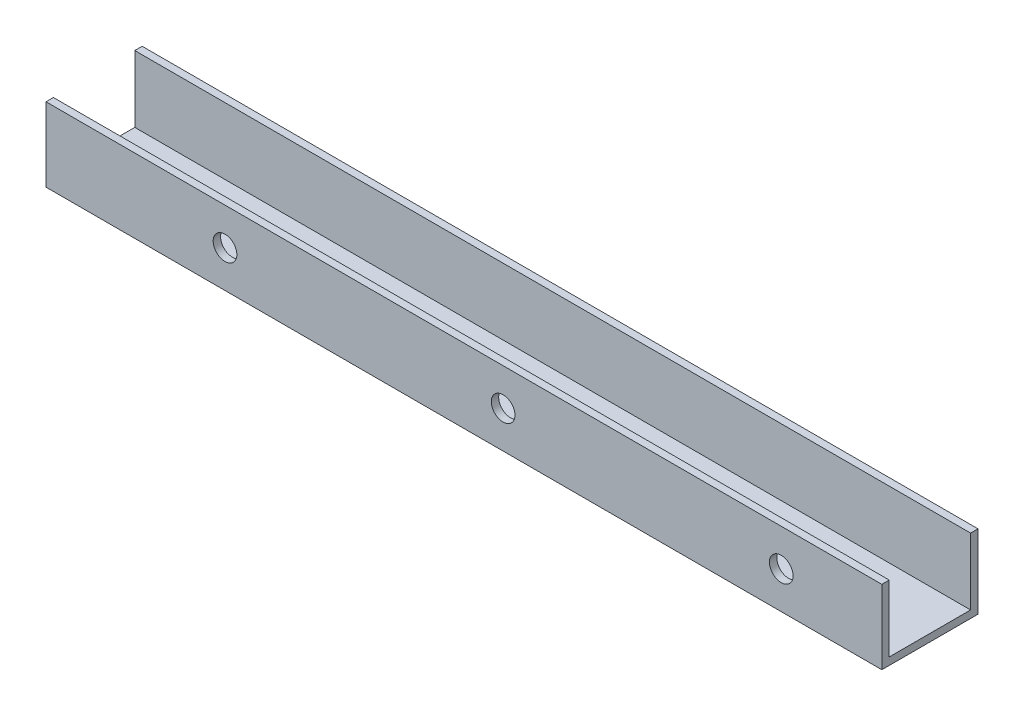
ISO-10303-21;
HEADER;
FILE_DESCRIPTION(('STEP AP214'),'2;1');
FILE_NAME('part.step','',(''),(''),'','','');
FILE_SCHEMA(('AUTOMOTIVE_DESIGN { 1 0 10303 214 1 1 1 1 }'));
ENDSEC;
DATA;
#1=APPLICATION_CONTEXT('core data for automotive mechanical design processes');
#2=APPLICATION_PROTOCOL_DEFINITION('international standard','automotive_design',2000,#1);
#3=PRODUCT_CONTEXT('',#1,'mechanical');
#4=PRODUCT('Part','Part','',(#3));
#5=PRODUCT_RELATED_PRODUCT_CATEGORY('part','',(#4));
#6=PRODUCT_DEFINITION_FORMATION('','',#4);
#7=PRODUCT_DEFINITION_CONTEXT('part definition',#1,'design');
#8=PRODUCT_DEFINITION('design','',#6,#7);
#9=PRODUCT_DEFINITION_SHAPE('','',#8);
#10=(LENGTH_UNIT() NAMED_UNIT(*) SI_UNIT(.MILLI.,.METRE.));
#11=(NAMED_UNIT(*) PLANE_ANGLE_UNIT() SI_UNIT($,.RADIAN.));
#12=(NAMED_UNIT(*) SI_UNIT($,.STERADIAN.) SOLID_ANGLE_UNIT());
#13=UNCERTAINTY_MEASURE_WITH_UNIT(LENGTH_MEASURE(1.E-05),#10,'distance_accuracy_value','');
#14=(GEOMETRIC_REPRESENTATION_CONTEXT(3) GLOBAL_UNCERTAINTY_ASSIGNED_CONTEXT((#13)) GLOBAL_UNIT_ASSIGNED_CONTEXT((#10,
#11,#12)) REPRESENTATION_CONTEXT('',''));
#15=CARTESIAN_POINT('',(0.,0.,0.));
#16=DIRECTION('',(0.,0.,1.));
#17=DIRECTION('',(1.,0.,0.));
#18=AXIS2_PLACEMENT_3D('',#15,#16,#17);
#19=CARTESIAN_POINT('',(0.,1.,0.));
#20=DIRECTION('',(0.,-1.,0.));
#21=DIRECTION('',(0.,0.,-1.));
#22=AXIS2_PLACEMENT_3D('',#19,#20,#21);
#23=PLANE('',#22);
#24=CARTESIAN_POINT('',(79.,1.,-6.5));
#25=DIRECTION('',(0.,1.,0.));
#26=DIRECTION('',(0.,0.,1.));
#27=AXIS2_PLACEMENT_3D('',#24,#25,#26);
#28=CIRCLE('',#27,1.60000000000001);
#29=CARTESIAN_POINT('',(79.,1.,-4.9));
#30=VERTEX_POINT('',#29);
#31=EDGE_CURVE('E164',#30,#30,#28,.T.);
#32=ORIENTED_EDGE('',*,*,#31,.F.);
#33=EDGE_LOOP('',(#32));
#34=FACE_BOUND('',#33,.T.);
#35=CARTESIAN_POINT('',(29.5,1.,-6.5));
#36=DIRECTION('',(0.,1.,0.));
#37=DIRECTION('',(0.,0.,1.));
#38=AXIS2_PLACEMENT_3D('',#35,#36,#37);
#39=CIRCLE('',#38,1.6);
#40=CARTESIAN_POINT('',(29.5,1.,-4.9));
#41=VERTEX_POINT('',#40);
#42=EDGE_CURVE('E143',#41,#41,#39,.T.);
#43=ORIENTED_EDGE('',*,*,#42,.F.);
#44=EDGE_LOOP('',(#43));
#45=FACE_BOUND('',#44,.T.);
#46=DIRECTION('',(-1.,0.,0.));
#47=VECTOR('',#46,1.);
#48=CARTESIAN_POINT('',(0.,1.,-1.));
#49=LINE('',#48,#47);
#50=CARTESIAN_POINT('',(113.,1.,-1.00000000000001));
#51=VERTEX_POINT('',#50);
#52=CARTESIAN_POINT('',(0.,1.,-1.));
#53=VERTEX_POINT('',#52);
#54=EDGE_CURVE('E53',#51,#53,#49,.T.);
#55=ORIENTED_EDGE('',*,*,#54,.F.);
#56=DIRECTION('',(0.,0.,-1.));
#57=VECTOR('',#56,1.);
#58=CARTESIAN_POINT('',(113.,1.,-13.));
#59=LINE('',#58,#57);
#60=CARTESIAN_POINT('',(113.,1.,-12.));
#61=VERTEX_POINT('',#60);
#62=EDGE_CURVE('E39',#51,#61,#59,.T.);
#63=ORIENTED_EDGE('',*,*,#62,.T.);
#64=DIRECTION('',(1.,0.,0.));
#65=VECTOR('',#64,1.);
#66=CARTESIAN_POINT('',(0.,1.,-12.));
#67=LINE('',#66,#65);
#68=CARTESIAN_POINT('',(0.,1.,-12.));
#69=VERTEX_POINT('',#68);
#70=EDGE_CURVE('E123',#69,#61,#67,.T.);
#71=ORIENTED_EDGE('',*,*,#70,.F.);
#72=DIRECTION('',(0.,0.,1.));
#73=VECTOR('',#72,1.);
#74=CARTESIAN_POINT('',(0.,1.,0.));
#75=LINE('',#74,#73);
#76=EDGE_CURVE('E58',#69,#53,#75,.T.);
#77=ORIENTED_EDGE('',*,*,#76,.T.);
#78=EDGE_LOOP('',(#55,#63,#71,#77));
#79=FACE_BOUND('',#78,.T.);
#80=ADVANCED_FACE('F35',(#34,#45,#79),#23,.F.);
#81=CARTESIAN_POINT('',(0.,0.,0.));
#82=DIRECTION('',(0.,-1.,0.));
#83=DIRECTION('',(0.,0.,-1.));
#84=AXIS2_PLACEMENT_3D('',#81,#82,#83);
#85=PLANE('',#84);
#86=CARTESIAN_POINT('',(79.,0.,-6.5));
#87=DIRECTION('',(0.,1.,0.));
#88=DIRECTION('',(0.,0.,1.));
#89=AXIS2_PLACEMENT_3D('',#86,#87,#88);
#90=CIRCLE('',#89,1.60000000000001);
#91=CARTESIAN_POINT('',(79.,0.,-4.9));
#92=VERTEX_POINT('',#91);
#93=EDGE_CURVE('E162',#92,#92,#90,.T.);
#94=ORIENTED_EDGE('',*,*,#93,.T.);
#95=EDGE_LOOP('',(#94));
#96=FACE_BOUND('',#95,.T.);
#97=DIRECTION('',(1.,0.,0.));
#98=VECTOR('',#97,1.);
#99=CARTESIAN_POINT('',(113.,0.,0.));
#100=LINE('',#99,#98);
#101=CARTESIAN_POINT('',(0.,0.,0.));
#102=VERTEX_POINT('',#101);
#103=CARTESIAN_POINT('',(113.,0.,0.));
#104=VERTEX_POINT('',#103);
#105=EDGE_CURVE('E167',#102,#104,#100,.T.);
#106=ORIENTED_EDGE('',*,*,#105,.F.);
#107=DIRECTION('',(0.,0.,1.));
#108=VECTOR('',#107,1.);
#109=CARTESIAN_POINT('',(0.,0.,0.));
#110=LINE('',#109,#108);
#111=CARTESIAN_POINT('',(0.,0.,-13.));
#112=VERTEX_POINT('',#111);
#113=EDGE_CURVE('E178',#112,#102,#110,.T.);
#114=ORIENTED_EDGE('',*,*,#113,.F.);
#115=DIRECTION('',(-1.,0.,0.));
#116=VECTOR('',#115,1.);
#117=CARTESIAN_POINT('',(0.,0.,-13.));
#118=LINE('',#117,#116);
#119=CARTESIAN_POINT('',(113.,0.,-13.));
#120=VERTEX_POINT('',#119);
#121=EDGE_CURVE('E176',#120,#112,#118,.T.);
#122=ORIENTED_EDGE('',*,*,#121,.F.);
#123=DIRECTION('',(0.,0.,-1.));
#124=VECTOR('',#123,1.);
#125=CARTESIAN_POINT('',(113.,0.,-13.));
#126=LINE('',#125,#124);
#127=EDGE_CURVE('E174',#104,#120,#126,.T.);
#128=ORIENTED_EDGE('',*,*,#127,.F.);
#129=EDGE_LOOP('',(#106,#114,#122,#128));
#130=FACE_BOUND('',#129,.T.);
#131=CARTESIAN_POINT('',(29.5,0.,-6.5));
#132=DIRECTION('',(0.,1.,0.));
#133=DIRECTION('',(0.,0.,1.));
#134=AXIS2_PLACEMENT_3D('',#131,#132,#133);
#135=CIRCLE('',#134,1.6);
#136=CARTESIAN_POINT('',(29.5,0.,-4.9));
#137=VERTEX_POINT('',#136);
#138=EDGE_CURVE('E153',#137,#137,#135,.T.);
#139=ORIENTED_EDGE('',*,*,#138,.T.);
#140=EDGE_LOOP('',(#139));
#141=FACE_BOUND('',#140,.T.);
#142=ADVANCED_FACE('F195',(#96,#130,#141),#85,.T.);
#143=CARTESIAN_POINT('',(113.,1.,0.));
#144=DIRECTION('',(0.,0.,-1.));
#145=DIRECTION('',(-1.,0.,0.));
#146=AXIS2_PLACEMENT_3D('',#143,#144,#145);
#147=PLANE('',#146);
#148=CARTESIAN_POINT('',(24.2,4.99999999999948,0.));
#149=DIRECTION('',(0.,0.,1.));
#150=DIRECTION('',(1.,0.,0.));
#151=AXIS2_PLACEMENT_3D('',#148,#149,#150);
#152=CIRCLE('',#151,1.60000000000001);
#153=CARTESIAN_POINT('',(25.8,4.99999999999948,0.));
#154=VERTEX_POINT('',#153);
#155=EDGE_CURVE('E217',#154,#154,#152,.T.);
#156=ORIENTED_EDGE('',*,*,#155,.F.);
#157=EDGE_LOOP('',(#156));
#158=FACE_BOUND('',#157,.T.);
#159=CARTESIAN_POINT('',(61.8,4.99999999999974,0.));
#160=DIRECTION('',(0.,0.,1.));
#161=DIRECTION('',(1.,0.,0.));
#162=AXIS2_PLACEMENT_3D('',#159,#160,#161);
#163=CIRCLE('',#162,1.60000000000001);
#164=CARTESIAN_POINT('',(63.4,4.99999999999974,0.));
#165=VERTEX_POINT('',#164);
#166=EDGE_CURVE('E209',#165,#165,#163,.T.);
#167=ORIENTED_EDGE('',*,*,#166,.F.);
#168=EDGE_LOOP('',(#167));
#169=FACE_BOUND('',#168,.T.);
#170=CARTESIAN_POINT('',(99.4,5.,0.));
#171=DIRECTION('',(0.,0.,1.));
#172=DIRECTION('',(1.,0.,0.));
#173=AXIS2_PLACEMENT_3D('',#170,#171,#172);
#174=CIRCLE('',#173,1.60000000000001);
#175=CARTESIAN_POINT('',(101.,5.,0.));
#176=VERTEX_POINT('',#175);
#177=EDGE_CURVE('E202',#176,#176,#174,.T.);
#178=ORIENTED_EDGE('',*,*,#177,.F.);
#179=EDGE_LOOP('',(#178));
#180=FACE_BOUND('',#179,.T.);
#181=ORIENTED_EDGE('',*,*,#105,.T.);
#182=DIRECTION('',(0.,-1.,0.));
#183=VECTOR('',#182,1.);
#184=CARTESIAN_POINT('',(113.,1.,0.));
#185=LINE('',#184,#183);
#186=CARTESIAN_POINT('',(113.,10.,0.));
#187=VERTEX_POINT('',#186);
#188=EDGE_CURVE('E11',#187,#104,#185,.T.);
#189=ORIENTED_EDGE('',*,*,#188,.F.);
#190=DIRECTION('',(1.,0.,0.));
#191=VECTOR('',#190,1.);
#192=CARTESIAN_POINT('',(113.,10.,0.));
#193=LINE('',#192,#191);
#194=CARTESIAN_POINT('',(0.,10.,0.));
#195=VERTEX_POINT('',#194);
#196=EDGE_CURVE('E118',#195,#187,#193,.T.);
#197=ORIENTED_EDGE('',*,*,#196,.F.);
#198=DIRECTION('',(0.,-1.,0.));
#199=VECTOR('',#198,1.);
#200=CARTESIAN_POINT('',(0.,1.,0.));
#201=LINE('',#200,#199);
#202=EDGE_CURVE('E180',#195,#102,#201,.T.);
#203=ORIENTED_EDGE('',*,*,#202,.T.);
#204=EDGE_LOOP('',(#181,#189,#197,#203));
#205=FACE_BOUND('',#204,.T.);
#206=ADVANCED_FACE('F37',(#158,#169,#180,#205),#147,.F.);
#207=CARTESIAN_POINT('',(113.,1.,-13.));
#208=DIRECTION('',(-1.,0.,0.));
#209=DIRECTION('',(0.,0.,1.));
#210=AXIS2_PLACEMENT_3D('',#207,#208,#209);
#211=PLANE('',#210);
#212=ORIENTED_EDGE('',*,*,#127,.T.);
#213=DIRECTION('',(0.,-1.,0.));
#214=VECTOR('',#213,1.);
#215=CARTESIAN_POINT('',(113.,1.,-13.));
#216=LINE('',#215,#214);
#217=CARTESIAN_POINT('',(113.,10.,-13.));
#218=VERTEX_POINT('',#217);
#219=EDGE_CURVE('E45',#218,#120,#216,.T.);
#220=ORIENTED_EDGE('',*,*,#219,.F.);
#221=DIRECTION('',(0.,0.,-1.));
#222=VECTOR('',#221,1.);
#223=CARTESIAN_POINT('',(113.,10.,-12.));
#224=LINE('',#223,#222);
#225=CARTESIAN_POINT('',(113.,10.,-12.));
#226=VERTEX_POINT('',#225);
#227=EDGE_CURVE('E137',#226,#218,#224,.T.);
#228=ORIENTED_EDGE('',*,*,#227,.F.);
#229=DIRECTION('',(0.,-1.,0.));
#230=VECTOR('',#229,1.);
#231=CARTESIAN_POINT('',(113.,10.,-12.));
#232=LINE('',#231,#230);
#233=EDGE_CURVE('E140',#226,#61,#232,.T.);
#234=ORIENTED_EDGE('',*,*,#233,.T.);
#235=ORIENTED_EDGE('',*,*,#62,.F.);
#236=DIRECTION('',(0.,-1.,0.));
#237=VECTOR('',#236,1.);
#238=CARTESIAN_POINT('',(113.,10.,-0.999999999999996));
#239=LINE('',#238,#237);
#240=CARTESIAN_POINT('',(113.,10.,-0.999999999999996));
#241=VERTEX_POINT('',#240);
#242=EDGE_CURVE('E105',#241,#51,#239,.T.);
#243=ORIENTED_EDGE('',*,*,#242,.F.);
#244=DIRECTION('',(0.,0.,-1.));
#245=VECTOR('',#244,1.);
#246=CARTESIAN_POINT('',(113.,10.,-0.999999999999996));
#247=LINE('',#246,#245);
#248=EDGE_CURVE('E112',#187,#241,#247,.T.);
#249=ORIENTED_EDGE('',*,*,#248,.F.);
#250=ORIENTED_EDGE('',*,*,#188,.T.);
#251=EDGE_LOOP('',(#212,#220,#228,#234,#235,#243,#249,#250));
#252=FACE_BOUND('',#251,.T.);
#253=ADVANCED_FACE('F121',(#252),#211,.F.);
#254=CARTESIAN_POINT('',(0.,1.,-13.));
#255=DIRECTION('',(0.,0.,1.));
#256=DIRECTION('',(1.,0.,0.));
#257=AXIS2_PLACEMENT_3D('',#254,#255,#256);
#258=PLANE('',#257);
#259=ORIENTED_EDGE('',*,*,#121,.T.);
#260=DIRECTION('',(0.,-1.,0.));
#261=VECTOR('',#260,1.);
#262=CARTESIAN_POINT('',(0.,1.,-13.));
#263=LINE('',#262,#261);
#264=CARTESIAN_POINT('',(0.,10.,-13.));
#265=VERTEX_POINT('',#264);
#266=EDGE_CURVE('E183',#265,#112,#263,.T.);
#267=ORIENTED_EDGE('',*,*,#266,.F.);
#268=DIRECTION('',(-1.,0.,0.));
#269=VECTOR('',#268,1.);
#270=CARTESIAN_POINT('',(113.,10.,-13.));
#271=LINE('',#270,#269);
#272=EDGE_CURVE('E126',#218,#265,#271,.T.);
#273=ORIENTED_EDGE('',*,*,#272,.F.);
#274=ORIENTED_EDGE('',*,*,#219,.T.);
#275=EDGE_LOOP('',(#259,#267,#273,#274));
#276=FACE_BOUND('',#275,.T.);
#277=ADVANCED_FACE('F190',(#276),#258,.F.);
#278=CARTESIAN_POINT('',(0.,1.,0.));
#279=DIRECTION('',(1.,0.,0.));
#280=DIRECTION('',(0.,0.,-1.));
#281=AXIS2_PLACEMENT_3D('',#278,#279,#280);
#282=PLANE('',#281);
#283=ORIENTED_EDGE('',*,*,#113,.T.);
#284=ORIENTED_EDGE('',*,*,#202,.F.);
#285=DIRECTION('',(0.,0.,1.));
#286=VECTOR('',#285,1.);
#287=CARTESIAN_POINT('',(0.,10.,0.));
#288=LINE('',#287,#286);
#289=CARTESIAN_POINT('',(0.,10.,-1.));
#290=VERTEX_POINT('',#289);
#291=EDGE_CURVE('E111',#290,#195,#288,.T.);
#292=ORIENTED_EDGE('',*,*,#291,.F.);
#293=DIRECTION('',(0.,-1.,0.));
#294=VECTOR('',#293,1.);
#295=CARTESIAN_POINT('',(0.,10.,-1.));
#296=LINE('',#295,#294);
#297=EDGE_CURVE('E107',#290,#53,#296,.T.);
#298=ORIENTED_EDGE('',*,*,#297,.T.);
#299=ORIENTED_EDGE('',*,*,#76,.F.);
#300=DIRECTION('',(0.,-1.,0.));
#301=VECTOR('',#300,1.);
#302=CARTESIAN_POINT('',(0.,10.,-12.));
#303=LINE('',#302,#301);
#304=CARTESIAN_POINT('',(0.,10.,-12.));
#305=VERTEX_POINT('',#304);
#306=EDGE_CURVE('E149',#305,#69,#303,.T.);
#307=ORIENTED_EDGE('',*,*,#306,.F.);
#308=DIRECTION('',(0.,0.,1.));
#309=VECTOR('',#308,1.);
#310=CARTESIAN_POINT('',(0.,10.,-13.));
#311=LINE('',#310,#309);
#312=EDGE_CURVE('E133',#265,#305,#311,.T.);
#313=ORIENTED_EDGE('',*,*,#312,.F.);
#314=ORIENTED_EDGE('',*,*,#266,.T.);
#315=EDGE_LOOP('',(#283,#284,#292,#298,#299,#307,#313,#314));
#316=FACE_BOUND('',#315,.T.);
#317=ADVANCED_FACE('F197',(#316),#282,.F.);
#318=CARTESIAN_POINT('',(79.,1.,-6.5));
#319=DIRECTION('',(0.,-1.,0.));
#320=DIRECTION('',(0.,0.,-1.));
#321=AXIS2_PLACEMENT_3D('',#318,#319,#320);
#322=CYLINDRICAL_SURFACE('',#321,1.60000000000001);
#323=ORIENTED_EDGE('',*,*,#31,.T.);
#324=EDGE_LOOP('',(#323));
#325=FACE_BOUND('',#324,.T.);
#326=ORIENTED_EDGE('',*,*,#93,.F.);
#327=EDGE_LOOP('',(#326));
#328=FACE_BOUND('',#327,.T.);
#329=ADVANCED_FACE('F256',(#325,#328),#322,.F.);
#330=CARTESIAN_POINT('',(29.5,1.,-6.5));
#331=DIRECTION('',(0.,-1.,0.));
#332=DIRECTION('',(0.,0.,-1.));
#333=AXIS2_PLACEMENT_3D('',#330,#331,#332);
#334=CYLINDRICAL_SURFACE('',#333,1.6);
#335=ORIENTED_EDGE('',*,*,#42,.T.);
#336=EDGE_LOOP('',(#335));
#337=FACE_BOUND('',#336,.T.);
#338=ORIENTED_EDGE('',*,*,#138,.F.);
#339=EDGE_LOOP('',(#338));
#340=FACE_BOUND('',#339,.T.);
#341=ADVANCED_FACE('F325',(#337,#340),#334,.F.);
#342=CARTESIAN_POINT('',(0.,10.,-12.));
#343=DIRECTION('',(0.,0.,-1.));
#344=DIRECTION('',(-1.,0.,0.));
#345=AXIS2_PLACEMENT_3D('',#342,#343,#344);
#346=PLANE('',#345);
#347=ORIENTED_EDGE('',*,*,#70,.T.);
#348=ORIENTED_EDGE('',*,*,#233,.F.);
#349=DIRECTION('',(1.,0.,0.));
#350=VECTOR('',#349,1.);
#351=CARTESIAN_POINT('',(0.,10.,-12.));
#352=LINE('',#351,#350);
#353=EDGE_CURVE('E135',#305,#226,#352,.T.);
#354=ORIENTED_EDGE('',*,*,#353,.F.);
#355=ORIENTED_EDGE('',*,*,#306,.T.);
#356=EDGE_LOOP('',(#347,#348,#354,#355));
#357=FACE_BOUND('',#356,.T.);
#358=ADVANCED_FACE('F315',(#357),#346,.F.);
#359=CARTESIAN_POINT('',(0.,10.,0.));
#360=DIRECTION('',(0.,1.,0.));
#361=DIRECTION('',(0.,0.,1.));
#362=AXIS2_PLACEMENT_3D('',#359,#360,#361);
#363=PLANE('',#362);
#364=ORIENTED_EDGE('',*,*,#272,.T.);
#365=ORIENTED_EDGE('',*,*,#312,.T.);
#366=ORIENTED_EDGE('',*,*,#353,.T.);
#367=ORIENTED_EDGE('',*,*,#227,.T.);
#368=EDGE_LOOP('',(#364,#365,#366,#367));
#369=FACE_BOUND('',#368,.T.);
#370=ADVANCED_FACE('F228',(#369),#363,.T.);
#371=CARTESIAN_POINT('',(0.,10.,-1.));
#372=DIRECTION('',(0.,0.,1.));
#373=DIRECTION('',(1.,0.,0.));
#374=AXIS2_PLACEMENT_3D('',#371,#372,#373);
#375=PLANE('',#374);
#376=CARTESIAN_POINT('',(24.2,4.99999999999948,-1.));
#377=DIRECTION('',(0.,0.,1.));
#378=DIRECTION('',(1.,0.,0.));
#379=AXIS2_PLACEMENT_3D('',#376,#377,#378);
#380=CIRCLE('',#379,1.60000000000001);
#381=CARTESIAN_POINT('',(25.8,4.99999999999948,-1.));
#382=VERTEX_POINT('',#381);
#383=EDGE_CURVE('E220',#382,#382,#380,.F.);
#384=ORIENTED_EDGE('',*,*,#383,.F.);
#385=EDGE_LOOP('',(#384));
#386=FACE_BOUND('',#385,.T.);
#387=CARTESIAN_POINT('',(61.8,4.99999999999974,-0.999999999999999));
#388=DIRECTION('',(0.,0.,1.));
#389=DIRECTION('',(1.,0.,0.));
#390=AXIS2_PLACEMENT_3D('',#387,#388,#389);
#391=CIRCLE('',#390,1.60000000000001);
#392=CARTESIAN_POINT('',(63.4,4.99999999999974,-0.999999999999999));
#393=VERTEX_POINT('',#392);
#394=EDGE_CURVE('E214',#393,#393,#391,.F.);
#395=ORIENTED_EDGE('',*,*,#394,.F.);
#396=EDGE_LOOP('',(#395));
#397=FACE_BOUND('',#396,.T.);
#398=CARTESIAN_POINT('',(99.4,5.,-0.999999999999996));
#399=DIRECTION('',(0.,0.,1.));
#400=DIRECTION('',(1.,0.,0.));
#401=AXIS2_PLACEMENT_3D('',#398,#399,#400);
#402=CIRCLE('',#401,1.60000000000001);
#403=CARTESIAN_POINT('',(101.,5.,-0.999999999999996));
#404=VERTEX_POINT('',#403);
#405=EDGE_CURVE('E204',#404,#404,#402,.F.);
#406=ORIENTED_EDGE('',*,*,#405,.F.);
#407=EDGE_LOOP('',(#406));
#408=FACE_BOUND('',#407,.T.);
#409=ORIENTED_EDGE('',*,*,#54,.T.);
#410=ORIENTED_EDGE('',*,*,#297,.F.);
#411=DIRECTION('',(-1.,0.,0.));
#412=VECTOR('',#411,1.);
#413=CARTESIAN_POINT('',(0.,10.,-1.));
#414=LINE('',#413,#412);
#415=EDGE_CURVE('E101',#241,#290,#414,.T.);
#416=ORIENTED_EDGE('',*,*,#415,.F.);
#417=ORIENTED_EDGE('',*,*,#242,.T.);
#418=EDGE_LOOP('',(#409,#410,#416,#417));
#419=FACE_BOUND('',#418,.T.);
#420=ADVANCED_FACE('F103',(#386,#397,#408,#419),#375,.F.);
#421=CARTESIAN_POINT('',(0.,10.,0.));
#422=DIRECTION('',(0.,-1.,0.));
#423=DIRECTION('',(0.,0.,-1.));
#424=AXIS2_PLACEMENT_3D('',#421,#422,#423);
#425=PLANE('',#424);
#426=ORIENTED_EDGE('',*,*,#248,.T.);
#427=ORIENTED_EDGE('',*,*,#415,.T.);
#428=ORIENTED_EDGE('',*,*,#291,.T.);
#429=ORIENTED_EDGE('',*,*,#196,.T.);
#430=EDGE_LOOP('',(#426,#427,#428,#429));
#431=FACE_BOUND('',#430,.T.);
#432=ADVANCED_FACE('F116',(#431),#425,.F.);
#433=CARTESIAN_POINT('',(99.4,5.,-13.001));
#434=DIRECTION('',(0.,0.,1.));
#435=DIRECTION('',(1.,0.,0.));
#436=AXIS2_PLACEMENT_3D('',#433,#434,#435);
#437=CYLINDRICAL_SURFACE('',#436,1.60000000000001);
#438=ORIENTED_EDGE('',*,*,#177,.T.);
#439=EDGE_LOOP('',(#438));
#440=FACE_BOUND('',#439,.T.);
#441=ORIENTED_EDGE('',*,*,#405,.T.);
#442=EDGE_LOOP('',(#441));
#443=FACE_BOUND('',#442,.T.);
#444=ADVANCED_FACE('F234',(#440,#443),#437,.F.);
#445=CARTESIAN_POINT('',(61.8,4.99999999999974,-13.001));
#446=DIRECTION('',(0.,0.,1.));
#447=DIRECTION('',(1.,0.,0.));
#448=AXIS2_PLACEMENT_3D('',#445,#446,#447);
#449=CYLINDRICAL_SURFACE('',#448,1.60000000000001);
#450=ORIENTED_EDGE('',*,*,#166,.T.);
#451=EDGE_LOOP('',(#450));
#452=FACE_BOUND('',#451,.T.);
#453=ORIENTED_EDGE('',*,*,#394,.T.);
#454=EDGE_LOOP('',(#453));
#455=FACE_BOUND('',#454,.T.);
#456=ADVANCED_FACE('F236',(#452,#455),#449,.F.);
#457=CARTESIAN_POINT('',(24.2,4.99999999999948,-13.001));
#458=DIRECTION('',(0.,0.,1.));
#459=DIRECTION('',(1.,0.,0.));
#460=AXIS2_PLACEMENT_3D('',#457,#458,#459);
#461=CYLINDRICAL_SURFACE('',#460,1.60000000000001);
#462=ORIENTED_EDGE('',*,*,#155,.T.);
#463=EDGE_LOOP('',(#462));
#464=FACE_BOUND('',#463,.T.);
#465=ORIENTED_EDGE('',*,*,#383,.T.);
#466=EDGE_LOOP('',(#465));
#467=FACE_BOUND('',#466,.T.);
#468=ADVANCED_FACE('F224',(#464,#467),#461,.F.);
#469=CLOSED_SHELL('',(#80,#142,#206,#253,#277,#317,#329,#341,#358,#370,#420,#432,#444,#456,#468));
#470=MANIFOLD_SOLID_BREP('B2',#469);
#471=ADVANCED_BREP_SHAPE_REPRESENTATION('',(#18,#470),#14);
#472=SHAPE_DEFINITION_REPRESENTATION(#9,#471);
ENDSEC;
END-ISO-10303-21;
